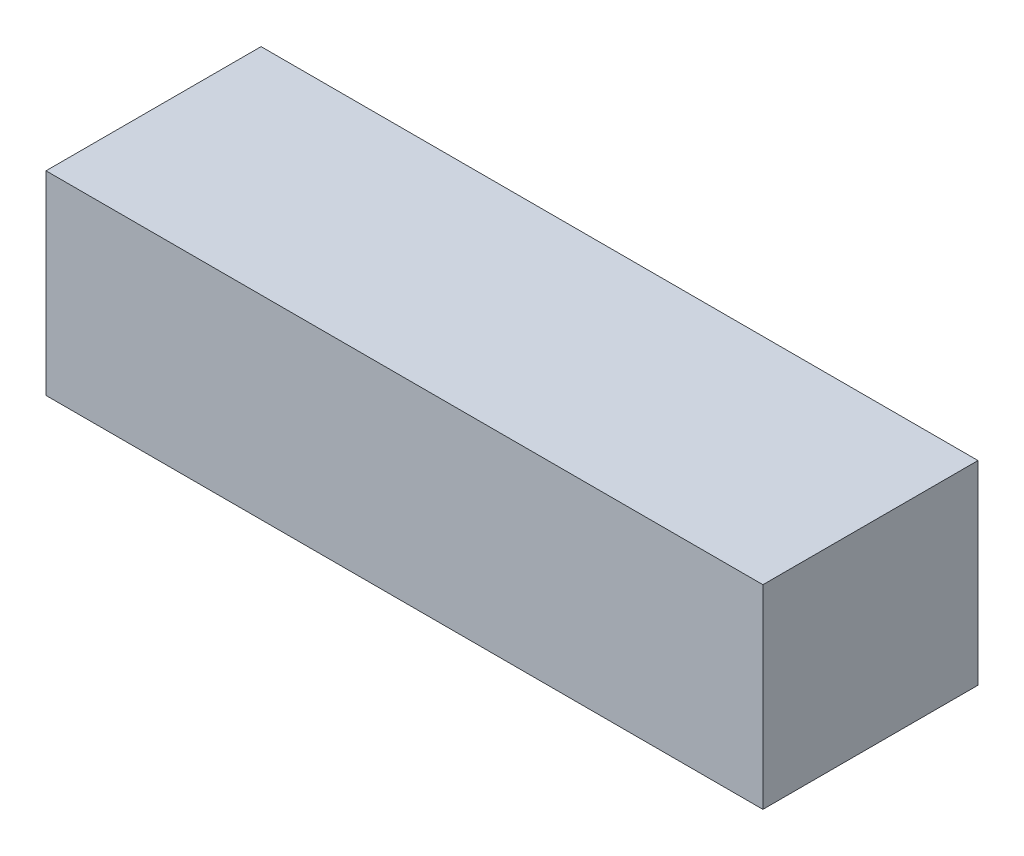
ISO-10303-21;
HEADER;
FILE_DESCRIPTION(('STEP AP214'),'2;1');
FILE_NAME('part.step','',(''),(''),'','','');
FILE_SCHEMA(('AUTOMOTIVE_DESIGN { 1 0 10303 214 1 1 1 1 }'));
ENDSEC;
DATA;
#1=APPLICATION_CONTEXT('core data for automotive mechanical design processes');
#2=APPLICATION_PROTOCOL_DEFINITION('international standard','automotive_design',2000,#1);
#3=PRODUCT_CONTEXT('',#1,'mechanical');
#4=PRODUCT('Part','Part','',(#3));
#5=PRODUCT_RELATED_PRODUCT_CATEGORY('part','',(#4));
#6=PRODUCT_DEFINITION_FORMATION('','',#4);
#7=PRODUCT_DEFINITION_CONTEXT('part definition',#1,'design');
#8=PRODUCT_DEFINITION('design','',#6,#7);
#9=PRODUCT_DEFINITION_SHAPE('','',#8);
#10=(LENGTH_UNIT() NAMED_UNIT(*) SI_UNIT(.MILLI.,.METRE.));
#11=(NAMED_UNIT(*) PLANE_ANGLE_UNIT() SI_UNIT($,.RADIAN.));
#12=(NAMED_UNIT(*) SI_UNIT($,.STERADIAN.) SOLID_ANGLE_UNIT());
#13=UNCERTAINTY_MEASURE_WITH_UNIT(LENGTH_MEASURE(1.E-05),#10,'distance_accuracy_value','');
#14=(GEOMETRIC_REPRESENTATION_CONTEXT(3) GLOBAL_UNCERTAINTY_ASSIGNED_CONTEXT((#13)) GLOBAL_UNIT_ASSIGNED_CONTEXT((#10,
#11,#12)) REPRESENTATION_CONTEXT('',''));
#15=CARTESIAN_POINT('',(0.,0.,0.));
#16=DIRECTION('',(0.,0.,1.));
#17=DIRECTION('',(1.,0.,0.));
#18=AXIS2_PLACEMENT_3D('',#15,#16,#17);
#19=CARTESIAN_POINT('',(70.,38.,21.));
#20=DIRECTION('',(-1.,0.,0.));
#21=DIRECTION('',(0.,0.,1.));
#22=AXIS2_PLACEMENT_3D('',#19,#20,#21);
#23=PLANE('',#22);
#24=DIRECTION('',(0.,0.,-1.));
#25=VECTOR('',#24,1.);
#26=CARTESIAN_POINT('',(70.,0.,21.));
#27=LINE('',#26,#25);
#28=CARTESIAN_POINT('',(70.,0.,21.));
#29=VERTEX_POINT('',#28);
#30=CARTESIAN_POINT('',(70.,0.,-21.));
#31=VERTEX_POINT('',#30);
#32=EDGE_CURVE('E107',#29,#31,#27,.T.);
#33=ORIENTED_EDGE('',*,*,#32,.T.);
#34=DIRECTION('',(0.,-1.,0.));
#35=VECTOR('',#34,1.);
#36=CARTESIAN_POINT('',(70.,38.,-21.));
#37=LINE('',#36,#35);
#38=CARTESIAN_POINT('',(70.,38.,-21.));
#39=VERTEX_POINT('',#38);
#40=EDGE_CURVE('E11',#39,#31,#37,.T.);
#41=ORIENTED_EDGE('',*,*,#40,.F.);
#42=DIRECTION('',(0.,0.,-1.));
#43=VECTOR('',#42,1.);
#44=CARTESIAN_POINT('',(70.,38.,21.));
#45=LINE('',#44,#43);
#46=CARTESIAN_POINT('',(70.,38.,21.));
#47=VERTEX_POINT('',#46);
#48=EDGE_CURVE('E91',#47,#39,#45,.T.);
#49=ORIENTED_EDGE('',*,*,#48,.F.);
#50=DIRECTION('',(0.,-1.,0.));
#51=VECTOR('',#50,1.);
#52=CARTESIAN_POINT('',(70.,38.,21.));
#53=LINE('',#52,#51);
#54=EDGE_CURVE('E103',#47,#29,#53,.T.);
#55=ORIENTED_EDGE('',*,*,#54,.T.);
#56=EDGE_LOOP('',(#33,#41,#49,#55));
#57=FACE_BOUND('',#56,.T.);
#58=ADVANCED_FACE('F39',(#57),#23,.F.);
#59=CARTESIAN_POINT('',(-70.,38.,-21.));
#60=DIRECTION('',(0.,0.,1.));
#61=DIRECTION('',(1.,0.,0.));
#62=AXIS2_PLACEMENT_3D('',#59,#60,#61);
#63=PLANE('',#62);
#64=DIRECTION('',(-1.,0.,0.));
#65=VECTOR('',#64,1.);
#66=CARTESIAN_POINT('',(-70.,0.,-21.));
#67=LINE('',#66,#65);
#68=CARTESIAN_POINT('',(-70.,0.,-21.));
#69=VERTEX_POINT('',#68);
#70=EDGE_CURVE('E96',#31,#69,#67,.T.);
#71=ORIENTED_EDGE('',*,*,#70,.T.);
#72=DIRECTION('',(0.,-1.,0.));
#73=VECTOR('',#72,1.);
#74=CARTESIAN_POINT('',(-70.,38.,-21.));
#75=LINE('',#74,#73);
#76=CARTESIAN_POINT('',(-70.,38.,-21.));
#77=VERTEX_POINT('',#76);
#78=EDGE_CURVE('E48',#77,#69,#75,.T.);
#79=ORIENTED_EDGE('',*,*,#78,.F.);
#80=DIRECTION('',(-1.,0.,0.));
#81=VECTOR('',#80,1.);
#82=CARTESIAN_POINT('',(-70.,38.,-21.));
#83=LINE('',#82,#81);
#84=EDGE_CURVE('E86',#39,#77,#83,.T.);
#85=ORIENTED_EDGE('',*,*,#84,.F.);
#86=ORIENTED_EDGE('',*,*,#40,.T.);
#87=EDGE_LOOP('',(#71,#79,#85,#86));
#88=FACE_BOUND('',#87,.T.);
#89=ADVANCED_FACE('F95',(#88),#63,.F.);
#90=CARTESIAN_POINT('',(-70.,38.,21.));
#91=DIRECTION('',(1.,0.,0.));
#92=DIRECTION('',(0.,0.,-1.));
#93=AXIS2_PLACEMENT_3D('',#90,#91,#92);
#94=PLANE('',#93);
#95=DIRECTION('',(0.,0.,1.));
#96=VECTOR('',#95,1.);
#97=CARTESIAN_POINT('',(-70.,0.,21.));
#98=LINE('',#97,#96);
#99=CARTESIAN_POINT('',(-70.,0.,21.));
#100=VERTEX_POINT('',#99);
#101=EDGE_CURVE('E73',#69,#100,#98,.T.);
#102=ORIENTED_EDGE('',*,*,#101,.T.);
#103=DIRECTION('',(0.,-1.,0.));
#104=VECTOR('',#103,1.);
#105=CARTESIAN_POINT('',(-70.,38.,21.));
#106=LINE('',#105,#104);
#107=CARTESIAN_POINT('',(-70.,38.,21.));
#108=VERTEX_POINT('',#107);
#109=EDGE_CURVE('E98',#108,#100,#106,.T.);
#110=ORIENTED_EDGE('',*,*,#109,.F.);
#111=DIRECTION('',(0.,0.,1.));
#112=VECTOR('',#111,1.);
#113=CARTESIAN_POINT('',(-70.,38.,21.));
#114=LINE('',#113,#112);
#115=EDGE_CURVE('E89',#77,#108,#114,.T.);
#116=ORIENTED_EDGE('',*,*,#115,.F.);
#117=ORIENTED_EDGE('',*,*,#78,.T.);
#118=EDGE_LOOP('',(#102,#110,#116,#117));
#119=FACE_BOUND('',#118,.T.);
#120=ADVANCED_FACE('F99',(#119),#94,.F.);
#121=CARTESIAN_POINT('',(-70.,38.,21.));
#122=DIRECTION('',(0.,0.,-1.));
#123=DIRECTION('',(-1.,0.,0.));
#124=AXIS2_PLACEMENT_3D('',#121,#122,#123);
#125=PLANE('',#124);
#126=DIRECTION('',(1.,0.,0.));
#127=VECTOR('',#126,1.);
#128=CARTESIAN_POINT('',(-70.,0.,21.));
#129=LINE('',#128,#127);
#130=EDGE_CURVE('E79',#100,#29,#129,.T.);
#131=ORIENTED_EDGE('',*,*,#130,.T.);
#132=ORIENTED_EDGE('',*,*,#54,.F.);
#133=DIRECTION('',(1.,0.,0.));
#134=VECTOR('',#133,1.);
#135=CARTESIAN_POINT('',(-70.,38.,21.));
#136=LINE('',#135,#134);
#137=EDGE_CURVE('E56',#108,#47,#136,.T.);
#138=ORIENTED_EDGE('',*,*,#137,.F.);
#139=ORIENTED_EDGE('',*,*,#109,.T.);
#140=EDGE_LOOP('',(#131,#132,#138,#139));
#141=FACE_BOUND('',#140,.T.);
#142=ADVANCED_FACE('F120',(#141),#125,.F.);
#143=CARTESIAN_POINT('',(0.,38.,0.));
#144=DIRECTION('',(0.,-1.,0.));
#145=DIRECTION('',(0.,0.,-1.));
#146=AXIS2_PLACEMENT_3D('',#143,#144,#145);
#147=PLANE('',#146);
#148=ORIENTED_EDGE('',*,*,#48,.T.);
#149=ORIENTED_EDGE('',*,*,#84,.T.);
#150=ORIENTED_EDGE('',*,*,#115,.T.);
#151=ORIENTED_EDGE('',*,*,#137,.T.);
#152=EDGE_LOOP('',(#148,#149,#150,#151));
#153=FACE_BOUND('',#152,.T.);
#154=ADVANCED_FACE('F87',(#153),#147,.F.);
#155=CARTESIAN_POINT('',(0.,0.,0.));
#156=DIRECTION('',(0.,-1.,0.));
#157=DIRECTION('',(0.,0.,-1.));
#158=AXIS2_PLACEMENT_3D('',#155,#156,#157);
#159=PLANE('',#158);
#160=ORIENTED_EDGE('',*,*,#32,.F.);
#161=ORIENTED_EDGE('',*,*,#130,.F.);
#162=ORIENTED_EDGE('',*,*,#101,.F.);
#163=ORIENTED_EDGE('',*,*,#70,.F.);
#164=EDGE_LOOP('',(#160,#161,#162,#163));
#165=FACE_BOUND('',#164,.T.);
#166=ADVANCED_FACE('F123',(#165),#159,.T.);
#167=CLOSED_SHELL('',(#58,#89,#120,#142,#154,#166));
#168=MANIFOLD_SOLID_BREP('B2',#167);
#169=ADVANCED_BREP_SHAPE_REPRESENTATION('',(#18,#168),#14);
#170=SHAPE_DEFINITION_REPRESENTATION(#9,#169);
ENDSEC;
END-ISO-10303-21;
